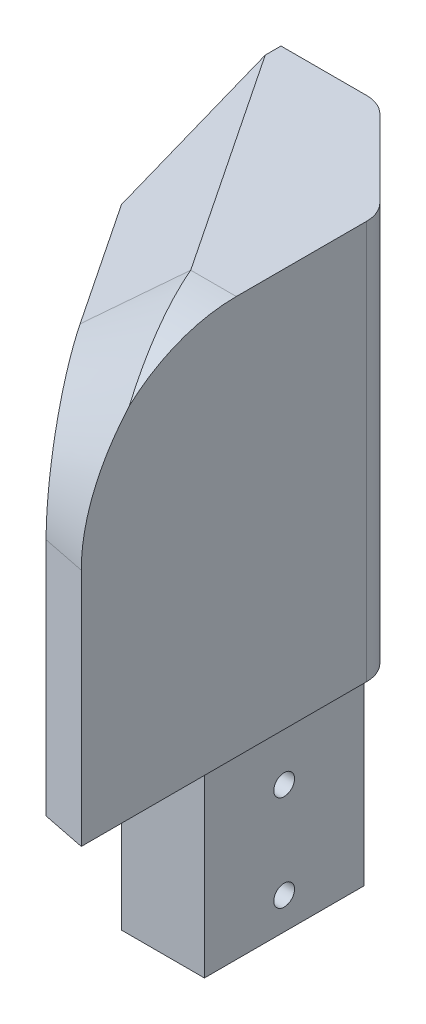
ISO-10303-21;
HEADER;
FILE_DESCRIPTION(('STEP AP214'),'2;1');
FILE_NAME('part.step','',(''),(''),'','','');
FILE_SCHEMA(('AUTOMOTIVE_DESIGN { 1 0 10303 214 1 1 1 1 }'));
ENDSEC;
DATA;
#1=APPLICATION_CONTEXT('core data for automotive mechanical design processes');
#2=APPLICATION_PROTOCOL_DEFINITION('international standard','automotive_design',2000,#1);
#3=PRODUCT_CONTEXT('',#1,'mechanical');
#4=PRODUCT('Part','Part','',(#3));
#5=PRODUCT_RELATED_PRODUCT_CATEGORY('part','',(#4));
#6=PRODUCT_DEFINITION_FORMATION('','',#4);
#7=PRODUCT_DEFINITION_CONTEXT('part definition',#1,'design');
#8=PRODUCT_DEFINITION('design','',#6,#7);
#9=PRODUCT_DEFINITION_SHAPE('','',#8);
#10=(LENGTH_UNIT() NAMED_UNIT(*) SI_UNIT(.MILLI.,.METRE.));
#11=(NAMED_UNIT(*) PLANE_ANGLE_UNIT() SI_UNIT($,.RADIAN.));
#12=(NAMED_UNIT(*) SI_UNIT($,.STERADIAN.) SOLID_ANGLE_UNIT());
#13=UNCERTAINTY_MEASURE_WITH_UNIT(LENGTH_MEASURE(1.E-05),#10,'distance_accuracy_value','');
#14=(GEOMETRIC_REPRESENTATION_CONTEXT(3) GLOBAL_UNCERTAINTY_ASSIGNED_CONTEXT((#13)) GLOBAL_UNIT_ASSIGNED_CONTEXT((#10,
#11,#12)) REPRESENTATION_CONTEXT('',''));
#15=CARTESIAN_POINT('',(0.,0.,0.));
#16=DIRECTION('',(0.,0.,1.));
#17=DIRECTION('',(1.,0.,0.));
#18=AXIS2_PLACEMENT_3D('',#15,#16,#17);
#19=CARTESIAN_POINT('',(-2.6,0.,-5.));
#20=DIRECTION('',(0.,0.,-1.));
#21=DIRECTION('',(-1.,0.,0.));
#22=AXIS2_PLACEMENT_3D('',#19,#20,#21);
#23=PLANE('',#22);
#24=DIRECTION('',(1.,0.,0.));
#25=VECTOR('',#24,1.);
#26=CARTESIAN_POINT('',(-2.6,43.,-5.));
#27=LINE('',#26,#25);
#28=CARTESIAN_POINT('',(-2.6,43.,-5.));
#29=VERTEX_POINT('',#28);
#30=CARTESIAN_POINT('',(2.77157287525379,43.,-5.));
#31=VERTEX_POINT('',#30);
#32=EDGE_CURVE('E206',#29,#31,#27,.T.);
#33=ORIENTED_EDGE('',*,*,#32,.T.);
#34=DIRECTION('',(0.,1.,0.));
#35=VECTOR('',#34,1.);
#36=CARTESIAN_POINT('',(2.77157287525379,0.,-5.));
#37=LINE('',#36,#35);
#38=CARTESIAN_POINT('',(2.77157287525379,17.5600968657159,-5.));
#39=VERTEX_POINT('',#38);
#40=EDGE_CURVE('E513',#31,#39,#37,.F.);
#41=ORIENTED_EDGE('',*,*,#40,.T.);
#42=CARTESIAN_POINT('',(3.6,17.,-5.));
#43=DIRECTION('',(0.,0.,-1.));
#44=DIRECTION('',(-1.,0.,0.));
#45=AXIS2_PLACEMENT_3D('',#42,#43,#44);
#46=CIRCLE('',#45,1.);
#47=CARTESIAN_POINT('',(2.6,17.,-5.));
#48=VERTEX_POINT('',#47);
#49=EDGE_CURVE('E533',#39,#48,#46,.F.);
#50=ORIENTED_EDGE('',*,*,#49,.T.);
#51=DIRECTION('',(0.,1.,0.));
#52=VECTOR('',#51,1.);
#53=CARTESIAN_POINT('',(2.6,0.,-5.));
#54=LINE('',#53,#52);
#55=CARTESIAN_POINT('',(2.6,0.,-5.));
#56=VERTEX_POINT('',#55);
#57=EDGE_CURVE('E488',#56,#48,#54,.T.);
#58=ORIENTED_EDGE('',*,*,#57,.F.);
#59=DIRECTION('',(1.,0.,0.));
#60=VECTOR('',#59,1.);
#61=CARTESIAN_POINT('',(-2.6,0.,-5.));
#62=LINE('',#61,#60);
#63=CARTESIAN_POINT('',(0.75,0.,-5.));
#64=VERTEX_POINT('',#63);
#65=EDGE_CURVE('E207',#64,#56,#62,.T.);
#66=ORIENTED_EDGE('',*,*,#65,.F.);
#67=DIRECTION('',(0.,1.,0.));
#68=VECTOR('',#67,1.);
#69=CARTESIAN_POINT('',(0.75,0.,-5.));
#70=LINE('',#69,#68);
#71=CARTESIAN_POINT('',(0.75,12.,-5.));
#72=VERTEX_POINT('',#71);
#73=EDGE_CURVE('E464',#64,#72,#70,.T.);
#74=ORIENTED_EDGE('',*,*,#73,.T.);
#75=DIRECTION('',(-1.,0.,0.));
#76=VECTOR('',#75,1.);
#77=CARTESIAN_POINT('',(0.75,12.,-5.));
#78=LINE('',#77,#76);
#79=CARTESIAN_POINT('',(-0.75,12.,-5.));
#80=VERTEX_POINT('',#79);
#81=EDGE_CURVE('E199',#72,#80,#78,.T.);
#82=ORIENTED_EDGE('',*,*,#81,.T.);
#83=DIRECTION('',(0.,1.,0.));
#84=VECTOR('',#83,1.);
#85=CARTESIAN_POINT('',(-0.75,0.,-5.));
#86=LINE('',#85,#84);
#87=CARTESIAN_POINT('',(-0.75,0.,-5.));
#88=VERTEX_POINT('',#87);
#89=EDGE_CURVE('E183',#88,#80,#86,.T.);
#90=ORIENTED_EDGE('',*,*,#89,.F.);
#91=CARTESIAN_POINT('',(-2.6,0.,-5.));
#92=VERTEX_POINT('',#91);
#93=EDGE_CURVE('E196',#92,#88,#62,.T.);
#94=ORIENTED_EDGE('',*,*,#93,.F.);
#95=DIRECTION('',(0.,1.,0.));
#96=VECTOR('',#95,1.);
#97=CARTESIAN_POINT('',(-2.6,0.,-5.));
#98=LINE('',#97,#96);
#99=EDGE_CURVE('E499',#92,#29,#98,.T.);
#100=ORIENTED_EDGE('',*,*,#99,.T.);
#101=EDGE_LOOP('',(#33,#41,#50,#58,#66,#74,#82,#90,#94,#100));
#102=FACE_BOUND('',#101,.T.);
#103=ADVANCED_FACE('F44',(#102),#23,.T.);
#104=CARTESIAN_POINT('',(-2.6,0.,0.));
#105=DIRECTION('',(0.,-1.,0.));
#106=DIRECTION('',(0.,0.,-1.));
#107=AXIS2_PLACEMENT_3D('',#104,#105,#106);
#108=PLANE('',#107);
#109=DIRECTION('',(-1.,0.,0.));
#110=VECTOR('',#109,1.);
#111=CARTESIAN_POINT('',(0.75,0.,2.75619856281309));
#112=LINE('',#111,#110);
#113=CARTESIAN_POINT('',(0.75,0.,2.75619856281309));
#114=VERTEX_POINT('',#113);
#115=CARTESIAN_POINT('',(-0.75,0.,2.75619856281309));
#116=VERTEX_POINT('',#115);
#117=EDGE_CURVE('E470',#114,#116,#112,.T.);
#118=ORIENTED_EDGE('',*,*,#117,.F.);
#119=DIRECTION('',(0.,0.,-1.));
#120=VECTOR('',#119,1.);
#121=CARTESIAN_POINT('',(0.75,0.,-2.85189418655657));
#122=LINE('',#121,#120);
#123=EDGE_CURVE('E461',#114,#64,#122,.T.);
#124=ORIENTED_EDGE('',*,*,#123,.T.);
#125=ORIENTED_EDGE('',*,*,#65,.T.);
#126=DIRECTION('',(0.,0.,-1.));
#127=VECTOR('',#126,1.);
#128=CARTESIAN_POINT('',(2.6,0.,0.));
#129=LINE('',#128,#127);
#130=CARTESIAN_POINT('',(2.6,0.,5.));
#131=VERTEX_POINT('',#130);
#132=EDGE_CURVE('E485',#131,#56,#129,.T.);
#133=ORIENTED_EDGE('',*,*,#132,.F.);
#134=DIRECTION('',(1.,0.,0.));
#135=VECTOR('',#134,1.);
#136=CARTESIAN_POINT('',(-2.6,0.,5.));
#137=LINE('',#136,#135);
#138=CARTESIAN_POINT('',(-2.6,0.,5.));
#139=VERTEX_POINT('',#138);
#140=EDGE_CURVE('E211',#139,#131,#137,.T.);
#141=ORIENTED_EDGE('',*,*,#140,.F.);
#142=DIRECTION('',(0.,0.,-1.));
#143=VECTOR('',#142,1.);
#144=CARTESIAN_POINT('',(-2.6,0.,0.));
#145=LINE('',#144,#143);
#146=EDGE_CURVE('E204',#139,#92,#145,.T.);
#147=ORIENTED_EDGE('',*,*,#146,.T.);
#148=ORIENTED_EDGE('',*,*,#93,.T.);
#149=DIRECTION('',(0.,0.,-1.));
#150=VECTOR('',#149,1.);
#151=CARTESIAN_POINT('',(-0.75,0.,-2.85189418655657));
#152=LINE('',#151,#150);
#153=EDGE_CURVE('E178',#116,#88,#152,.T.);
#154=ORIENTED_EDGE('',*,*,#153,.F.);
#155=EDGE_LOOP('',(#118,#124,#125,#133,#141,#147,#148,#154));
#156=FACE_BOUND('',#155,.T.);
#157=ADVANCED_FACE('F202',(#156),#108,.T.);
#158=CARTESIAN_POINT('',(-2.6,2.,0.));
#159=DIRECTION('',(1.,0.,0.));
#160=DIRECTION('',(0.,0.,-1.));
#161=AXIS2_PLACEMENT_3D('',#158,#159,#160);
#162=CYLINDRICAL_SURFACE('',#161,0.65);
#163=CARTESIAN_POINT('',(2.6,2.,0.));
#164=DIRECTION('',(1.,0.,0.));
#165=DIRECTION('',(0.,0.,-1.));
#166=AXIS2_PLACEMENT_3D('',#163,#164,#165);
#167=CIRCLE('',#166,0.65);
#168=CARTESIAN_POINT('',(2.6,2.,-0.65));
#169=VERTEX_POINT('',#168);
#170=EDGE_CURVE('E479',#169,#169,#167,.T.);
#171=ORIENTED_EDGE('',*,*,#170,.T.);
#172=EDGE_LOOP('',(#171));
#173=FACE_BOUND('',#172,.T.);
#174=CARTESIAN_POINT('',(0.75,2.,0.));
#175=DIRECTION('',(-1.,0.,0.));
#176=DIRECTION('',(0.,0.,1.));
#177=AXIS2_PLACEMENT_3D('',#174,#175,#176);
#178=CIRCLE('',#177,0.65);
#179=CARTESIAN_POINT('',(0.75,2.,0.65));
#180=VERTEX_POINT('',#179);
#181=EDGE_CURVE('E223',#180,#180,#178,.F.);
#182=ORIENTED_EDGE('',*,*,#181,.F.);
#183=EDGE_LOOP('',(#182));
#184=FACE_BOUND('',#183,.T.);
#185=ADVANCED_FACE('F345',(#173,#184),#162,.F.);
#186=CARTESIAN_POINT('',(-2.6,8.,0.));
#187=DIRECTION('',(1.,0.,0.));
#188=DIRECTION('',(0.,0.,-1.));
#189=AXIS2_PLACEMENT_3D('',#186,#187,#188);
#190=CYLINDRICAL_SURFACE('',#189,0.649999999999999);
#191=CARTESIAN_POINT('',(2.6,8.,0.));
#192=DIRECTION('',(1.,0.,0.));
#193=DIRECTION('',(0.,0.,-1.));
#194=AXIS2_PLACEMENT_3D('',#191,#192,#193);
#195=CIRCLE('',#194,0.649999999999999);
#196=CARTESIAN_POINT('',(2.6,8.,-0.649999999999999));
#197=VERTEX_POINT('',#196);
#198=EDGE_CURVE('E491',#197,#197,#195,.T.);
#199=ORIENTED_EDGE('',*,*,#198,.T.);
#200=EDGE_LOOP('',(#199));
#201=FACE_BOUND('',#200,.T.);
#202=CARTESIAN_POINT('',(0.75,8.,0.));
#203=DIRECTION('',(-1.,0.,0.));
#204=DIRECTION('',(0.,0.,1.));
#205=AXIS2_PLACEMENT_3D('',#202,#203,#204);
#206=CIRCLE('',#205,0.649999999999999);
#207=CARTESIAN_POINT('',(0.75,8.,0.649999999999999));
#208=VERTEX_POINT('',#207);
#209=EDGE_CURVE('E220',#208,#208,#206,.F.);
#210=ORIENTED_EDGE('',*,*,#209,.F.);
#211=EDGE_LOOP('',(#210));
#212=FACE_BOUND('',#211,.T.);
#213=ADVANCED_FACE('F340',(#201,#212),#190,.F.);
#214=CARTESIAN_POINT('',(-2.6,43.,0.));
#215=DIRECTION('',(0.,-1.,0.));
#216=DIRECTION('',(0.,0.,-1.));
#217=AXIS2_PLACEMENT_3D('',#214,#215,#216);
#218=PLANE('',#217);
#219=DIRECTION('',(0.,0.,-1.));
#220=VECTOR('',#219,1.);
#221=CARTESIAN_POINT('',(-2.6,43.,0.));
#222=LINE('',#221,#220);
#223=CARTESIAN_POINT('',(-2.6,43.,-4.01387818866041));
#224=VERTEX_POINT('',#223);
#225=EDGE_CURVE('E358',#224,#29,#222,.T.);
#226=ORIENTED_EDGE('',*,*,#225,.F.);
#227=DIRECTION('',(0.554700196225228,0.,0.832050294337844));
#228=VECTOR('',#227,1.);
#229=CARTESIAN_POINT('',(4.89358480502275,43.,7.22649901887375));
#230=LINE('',#229,#228);
#231=CARTESIAN_POINT('',(6.74258545910691,43.,10.));
#232=VERTEX_POINT('',#231);
#233=EDGE_CURVE('E245',#224,#232,#230,.T.);
#234=ORIENTED_EDGE('',*,*,#233,.T.);
#235=DIRECTION('',(1.,0.,0.));
#236=VECTOR('',#235,1.);
#237=CARTESIAN_POINT('',(-2.6,43.,10.));
#238=LINE('',#237,#236);
#239=CARTESIAN_POINT('',(9.6,43.,10.));
#240=VERTEX_POINT('',#239);
#241=EDGE_CURVE('E228',#232,#240,#238,.T.);
#242=ORIENTED_EDGE('',*,*,#241,.T.);
#243=DIRECTION('',(0.,0.,1.));
#244=VECTOR('',#243,1.);
#245=CARTESIAN_POINT('',(9.6,43.,-5.));
#246=LINE('',#245,#244);
#247=CARTESIAN_POINT('',(9.6,43.,1.8284271247462));
#248=VERTEX_POINT('',#247);
#249=EDGE_CURVE('E439',#248,#240,#246,.T.);
#250=ORIENTED_EDGE('',*,*,#249,.F.);
#251=CARTESIAN_POINT('',(7.6,43.,1.8284271247462));
#252=DIRECTION('',(0.,-1.,0.));
#253=DIRECTION('',(0.,0.,-1.));
#254=AXIS2_PLACEMENT_3D('',#251,#252,#253);
#255=CIRCLE('',#254,2.);
#256=CARTESIAN_POINT('',(9.01421356237309,43.,0.414213562373101));
#257=VERTEX_POINT('',#256);
#258=EDGE_CURVE('E869',#248,#257,#255,.F.);
#259=ORIENTED_EDGE('',*,*,#258,.T.);
#260=DIRECTION('',(0.707106781186549,0.,0.707106781186546));
#261=VECTOR('',#260,1.);
#262=CARTESIAN_POINT('',(9.6,43.,1.00000000000001));
#263=LINE('',#262,#261);
#264=CARTESIAN_POINT('',(4.18578643762688,43.,-4.4142135623731));
#265=VERTEX_POINT('',#264);
#266=EDGE_CURVE('E875',#257,#265,#263,.F.);
#267=ORIENTED_EDGE('',*,*,#266,.T.);
#268=CARTESIAN_POINT('',(2.77157287525379,43.,-3.));
#269=DIRECTION('',(0.,-1.,0.));
#270=DIRECTION('',(0.,0.,-1.));
#271=AXIS2_PLACEMENT_3D('',#268,#269,#270);
#272=CIRCLE('',#271,2.);
#273=EDGE_CURVE('E871',#265,#31,#272,.F.);
#274=ORIENTED_EDGE('',*,*,#273,.T.);
#275=ORIENTED_EDGE('',*,*,#32,.F.);
#276=EDGE_LOOP('',(#226,#234,#242,#250,#259,#267,#274,#275));
#277=FACE_BOUND('',#276,.T.);
#278=ADVANCED_FACE('F348',(#277),#218,.F.);
#279=CARTESIAN_POINT('',(-2.6,0.,5.));
#280=DIRECTION('',(0.,0.,-1.));
#281=DIRECTION('',(-1.,0.,0.));
#282=AXIS2_PLACEMENT_3D('',#279,#280,#281);
#283=PLANE('',#282);
#284=DIRECTION('',(0.,1.,0.));
#285=VECTOR('',#284,1.);
#286=CARTESIAN_POINT('',(2.6,0.,5.));
#287=LINE('',#286,#285);
#288=CARTESIAN_POINT('',(2.6,12.,5.));
#289=VERTEX_POINT('',#288);
#290=EDGE_CURVE('E482',#131,#289,#287,.T.);
#291=ORIENTED_EDGE('',*,*,#290,.T.);
#292=DIRECTION('',(-1.,0.,0.));
#293=VECTOR('',#292,1.);
#294=CARTESIAN_POINT('',(-2.6,12.,5.));
#295=LINE('',#294,#293);
#296=CARTESIAN_POINT('',(-2.6,12.,4.99999999999993));
#297=VERTEX_POINT('',#296);
#298=EDGE_CURVE('E509',#289,#297,#295,.T.);
#299=ORIENTED_EDGE('',*,*,#298,.T.);
#300=DIRECTION('',(0.,1.,0.));
#301=VECTOR('',#300,1.);
#302=CARTESIAN_POINT('',(-2.6,0.,5.));
#303=LINE('',#302,#301);
#304=EDGE_CURVE('E362',#139,#297,#303,.T.);
#305=ORIENTED_EDGE('',*,*,#304,.F.);
#306=ORIENTED_EDGE('',*,*,#140,.T.);
#307=EDGE_LOOP('',(#291,#299,#305,#306));
#308=FACE_BOUND('',#307,.T.);
#309=ADVANCED_FACE('F346',(#308),#283,.F.);
#310=CARTESIAN_POINT('',(-0.75,2.,0.));
#311=DIRECTION('',(-1.,0.,0.));
#312=DIRECTION('',(0.,0.,1.));
#313=AXIS2_PLACEMENT_3D('',#310,#311,#312);
#314=CIRCLE('',#313,0.65);
#315=CARTESIAN_POINT('',(-0.75,2.,0.65));
#316=VERTEX_POINT('',#315);
#317=EDGE_CURVE('E219',#316,#316,#314,.F.);
#318=ORIENTED_EDGE('',*,*,#317,.T.);
#319=EDGE_LOOP('',(#318));
#320=FACE_BOUND('',#319,.T.);
#321=CARTESIAN_POINT('',(-2.6,2.,0.));
#322=DIRECTION('',(1.,0.,0.));
#323=DIRECTION('',(0.,0.,-1.));
#324=AXIS2_PLACEMENT_3D('',#321,#322,#323);
#325=CIRCLE('',#324,0.65);
#326=CARTESIAN_POINT('',(-2.6,2.,-0.65));
#327=VERTEX_POINT('',#326);
#328=EDGE_CURVE('E363',#327,#327,#325,.T.);
#329=ORIENTED_EDGE('',*,*,#328,.F.);
#330=EDGE_LOOP('',(#329));
#331=FACE_BOUND('',#330,.T.);
#332=ADVANCED_FACE('F277',(#320,#331),#162,.F.);
#333=CARTESIAN_POINT('',(-0.75,8.,0.));
#334=DIRECTION('',(-1.,0.,0.));
#335=DIRECTION('',(0.,0.,1.));
#336=AXIS2_PLACEMENT_3D('',#333,#334,#335);
#337=CIRCLE('',#336,0.649999999999999);
#338=CARTESIAN_POINT('',(-0.75,8.,0.649999999999999));
#339=VERTEX_POINT('',#338);
#340=EDGE_CURVE('E216',#339,#339,#337,.F.);
#341=ORIENTED_EDGE('',*,*,#340,.T.);
#342=EDGE_LOOP('',(#341));
#343=FACE_BOUND('',#342,.T.);
#344=CARTESIAN_POINT('',(-2.6,8.,0.));
#345=DIRECTION('',(1.,0.,0.));
#346=DIRECTION('',(0.,0.,-1.));
#347=AXIS2_PLACEMENT_3D('',#344,#345,#346);
#348=CIRCLE('',#347,0.649999999999999);
#349=CARTESIAN_POINT('',(-2.6,8.,-0.649999999999999));
#350=VERTEX_POINT('',#349);
#351=EDGE_CURVE('E215',#350,#350,#348,.T.);
#352=ORIENTED_EDGE('',*,*,#351,.F.);
#353=EDGE_LOOP('',(#352));
#354=FACE_BOUND('',#353,.T.);
#355=ADVANCED_FACE('F335',(#343,#354),#190,.F.);
#356=CARTESIAN_POINT('',(-2.6,0.,0.));
#357=DIRECTION('',(1.,0.,0.));
#358=DIRECTION('',(0.,0.,-1.));
#359=AXIS2_PLACEMENT_3D('',#356,#357,#358);
#360=PLANE('',#359);
#361=ORIENTED_EDGE('',*,*,#328,.T.);
#362=EDGE_LOOP('',(#361));
#363=FACE_BOUND('',#362,.T.);
#364=DIRECTION('',(0.,1.,0.));
#365=VECTOR('',#364,1.);
#366=CARTESIAN_POINT('',(-2.6,0.,4.99999999999993));
#367=LINE('',#366,#365);
#368=CARTESIAN_POINT('',(-2.6,39.3944487245359,4.99999999999993));
#369=VERTEX_POINT('',#368);
#370=EDGE_CURVE('E209',#297,#369,#367,.T.);
#371=ORIENTED_EDGE('',*,*,#370,.T.);
#372=DIRECTION('',(0.,-0.371390676354102,0.92847669088526));
#373=VECTOR('',#372,1.);
#374=CARTESIAN_POINT('',(-2.6,42.0417797427601,-1.61832754556069));
#375=LINE('',#374,#373);
#376=EDGE_CURVE('E368',#369,#224,#375,.F.);
#377=ORIENTED_EDGE('',*,*,#376,.T.);
#378=ORIENTED_EDGE('',*,*,#225,.T.);
#379=ORIENTED_EDGE('',*,*,#99,.F.);
#380=ORIENTED_EDGE('',*,*,#146,.F.);
#381=ORIENTED_EDGE('',*,*,#304,.T.);
#382=EDGE_LOOP('',(#371,#377,#378,#379,#380,#381));
#383=FACE_BOUND('',#382,.T.);
#384=ORIENTED_EDGE('',*,*,#351,.T.);
#385=EDGE_LOOP('',(#384));
#386=FACE_BOUND('',#385,.T.);
#387=ADVANCED_FACE('F331',(#363,#383,#386),#360,.F.);
#388=CARTESIAN_POINT('',(2.6,0.,0.));
#389=DIRECTION('',(1.,0.,0.));
#390=DIRECTION('',(0.,0.,-1.));
#391=AXIS2_PLACEMENT_3D('',#388,#389,#390);
#392=PLANE('',#391);
#393=ORIENTED_EDGE('',*,*,#57,.T.);
#394=DIRECTION('',(0.,0.,-1.));
#395=VECTOR('',#394,1.);
#396=CARTESIAN_POINT('',(2.6,17.,11.));
#397=LINE('',#396,#395);
#398=CARTESIAN_POINT('',(2.6,17.,7.6833752096446));
#399=VERTEX_POINT('',#398);
#400=EDGE_CURVE('E524',#48,#399,#397,.F.);
#401=ORIENTED_EDGE('',*,*,#400,.T.);
#402=CARTESIAN_POINT('',(2.6,12.,11.));
#403=DIRECTION('',(1.,0.,0.));
#404=DIRECTION('',(0.,0.,-1.));
#405=AXIS2_PLACEMENT_3D('',#402,#403,#404);
#406=CIRCLE('',#405,6.);
#407=EDGE_CURVE('E520',#399,#289,#406,.F.);
#408=ORIENTED_EDGE('',*,*,#407,.T.);
#409=ORIENTED_EDGE('',*,*,#290,.F.);
#410=ORIENTED_EDGE('',*,*,#132,.T.);
#411=EDGE_LOOP('',(#393,#401,#408,#409,#410));
#412=FACE_BOUND('',#411,.T.);
#413=ORIENTED_EDGE('',*,*,#170,.F.);
#414=EDGE_LOOP('',(#413));
#415=FACE_BOUND('',#414,.T.);
#416=ORIENTED_EDGE('',*,*,#198,.F.);
#417=EDGE_LOOP('',(#416));
#418=FACE_BOUND('',#417,.T.);
#419=ADVANCED_FACE('F321',(#412,#415,#418),#392,.T.);
#420=CARTESIAN_POINT('',(0.75,0.,0.));
#421=DIRECTION('',(-1.,0.,0.));
#422=DIRECTION('',(0.,0.,1.));
#423=AXIS2_PLACEMENT_3D('',#420,#421,#422);
#424=PLANE('',#423);
#425=ORIENTED_EDGE('',*,*,#123,.F.);
#426=DIRECTION('',(0.,-0.998508217849995,0.0546016381258519));
#427=VECTOR('',#426,1.);
#428=CARTESIAN_POINT('',(0.75,0.,2.75619856281309));
#429=LINE('',#428,#427);
#430=CARTESIAN_POINT('',(0.75,12.,2.1));
#431=VERTEX_POINT('',#430);
#432=EDGE_CURVE('E468',#431,#114,#429,.T.);
#433=ORIENTED_EDGE('',*,*,#432,.F.);
#434=DIRECTION('',(0.,0.,1.));
#435=VECTOR('',#434,1.);
#436=CARTESIAN_POINT('',(0.75,12.,-2.1));
#437=LINE('',#436,#435);
#438=EDGE_CURVE('E466',#72,#431,#437,.T.);
#439=ORIENTED_EDGE('',*,*,#438,.F.);
#440=ORIENTED_EDGE('',*,*,#73,.F.);
#441=EDGE_LOOP('',(#425,#433,#439,#440));
#442=FACE_BOUND('',#441,.T.);
#443=ORIENTED_EDGE('',*,*,#209,.T.);
#444=EDGE_LOOP('',(#443));
#445=FACE_BOUND('',#444,.T.);
#446=ORIENTED_EDGE('',*,*,#181,.T.);
#447=EDGE_LOOP('',(#446));
#448=FACE_BOUND('',#447,.T.);
#449=ADVANCED_FACE('F317',(#442,#445,#448),#424,.T.);
#450=CARTESIAN_POINT('',(-0.75,0.,0.));
#451=DIRECTION('',(-1.,0.,0.));
#452=DIRECTION('',(0.,0.,1.));
#453=AXIS2_PLACEMENT_3D('',#450,#451,#452);
#454=PLANE('',#453);
#455=ORIENTED_EDGE('',*,*,#340,.F.);
#456=EDGE_LOOP('',(#455));
#457=FACE_BOUND('',#456,.T.);
#458=ORIENTED_EDGE('',*,*,#153,.T.);
#459=ORIENTED_EDGE('',*,*,#89,.T.);
#460=DIRECTION('',(0.,0.,1.));
#461=VECTOR('',#460,1.);
#462=CARTESIAN_POINT('',(-0.75,12.,-2.1));
#463=LINE('',#462,#461);
#464=CARTESIAN_POINT('',(-0.75,12.,2.1));
#465=VERTEX_POINT('',#464);
#466=EDGE_CURVE('E200',#80,#465,#463,.T.);
#467=ORIENTED_EDGE('',*,*,#466,.T.);
#468=DIRECTION('',(0.,-0.998508217849995,0.0546016381258519));
#469=VECTOR('',#468,1.);
#470=CARTESIAN_POINT('',(-0.75,0.,2.75619856281309));
#471=LINE('',#470,#469);
#472=EDGE_CURVE('E186',#465,#116,#471,.T.);
#473=ORIENTED_EDGE('',*,*,#472,.T.);
#474=EDGE_LOOP('',(#458,#459,#467,#473));
#475=FACE_BOUND('',#474,.T.);
#476=ORIENTED_EDGE('',*,*,#317,.F.);
#477=EDGE_LOOP('',(#476));
#478=FACE_BOUND('',#477,.T.);
#479=ADVANCED_FACE('F180',(#457,#475,#478),#454,.F.);
#480=CARTESIAN_POINT('',(0.75,12.,2.1));
#481=DIRECTION('',(0.,-1.,0.));
#482=DIRECTION('',(0.,0.,-1.));
#483=AXIS2_PLACEMENT_3D('',#480,#481,#482);
#484=PLANE('',#483);
#485=ORIENTED_EDGE('',*,*,#81,.F.);
#486=ORIENTED_EDGE('',*,*,#438,.T.);
#487=DIRECTION('',(-1.,0.,0.));
#488=VECTOR('',#487,1.);
#489=CARTESIAN_POINT('',(0.75,12.,2.1));
#490=LINE('',#489,#488);
#491=EDGE_CURVE('E472',#431,#465,#490,.T.);
#492=ORIENTED_EDGE('',*,*,#491,.T.);
#493=ORIENTED_EDGE('',*,*,#466,.F.);
#494=EDGE_LOOP('',(#485,#486,#492,#493));
#495=FACE_BOUND('',#494,.T.);
#496=ADVANCED_FACE('F316',(#495),#484,.T.);
#497=CARTESIAN_POINT('',(0.75,0.,2.75619856281309));
#498=DIRECTION('',(0.,-0.0546016381258519,-0.998508217849995));
#499=DIRECTION('',(0.,0.998508217849995,-0.054601638125852));
#500=AXIS2_PLACEMENT_3D('',#497,#498,#499);
#501=PLANE('',#500);
#502=ORIENTED_EDGE('',*,*,#491,.F.);
#503=ORIENTED_EDGE('',*,*,#432,.T.);
#504=ORIENTED_EDGE('',*,*,#117,.T.);
#505=ORIENTED_EDGE('',*,*,#472,.F.);
#506=EDGE_LOOP('',(#502,#503,#504,#505));
#507=FACE_BOUND('',#506,.T.);
#508=ADVANCED_FACE('F312',(#507),#501,.T.);
#509=CARTESIAN_POINT('',(2.6,18.,20.));
#510=DIRECTION('',(0.,-1.,0.));
#511=DIRECTION('',(0.,0.,-1.));
#512=AXIS2_PLACEMENT_3D('',#509,#510,#511);
#513=PLANE('',#512);
#514=DIRECTION('',(0.,0.,-1.));
#515=VECTOR('',#514,1.);
#516=CARTESIAN_POINT('',(9.6,18.,20.));
#517=LINE('',#516,#515);
#518=CARTESIAN_POINT('',(9.6,18.,19.7188897449072));
#519=VERTEX_POINT('',#518);
#520=CARTESIAN_POINT('',(9.6,18.,1.8284271247462));
#521=VERTEX_POINT('',#520);
#522=EDGE_CURVE('E191',#519,#521,#517,.T.);
#523=ORIENTED_EDGE('',*,*,#522,.F.);
#524=DIRECTION('',(0.980580675690921,0.,0.196116135138183));
#525=VECTOR('',#524,1.);
#526=CARTESIAN_POINT('',(2.92329043367169,18.,18.3835478316415));
#527=LINE('',#526,#525);
#528=CARTESIAN_POINT('',(6.84529980377477,18.,19.1679497056621));
#529=VERTEX_POINT('',#528);
#530=EDGE_CURVE('E11',#519,#529,#527,.F.);
#531=ORIENTED_EDGE('',*,*,#530,.T.);
#532=DIRECTION('',(0.554700196225228,0.,0.832050294337844));
#533=VECTOR('',#532,1.);
#534=CARTESIAN_POINT('',(5.92307692307694,18.,17.7846153846154));
#535=LINE('',#534,#533);
#536=CARTESIAN_POINT('',(1.40000000000003,18.,11.));
#537=VERTEX_POINT('',#536);
#538=EDGE_CURVE('E226',#529,#537,#535,.F.);
#539=ORIENTED_EDGE('',*,*,#538,.T.);
#540=DIRECTION('',(-1.,0.,0.));
#541=VECTOR('',#540,1.);
#542=CARTESIAN_POINT('',(2.6,18.,11.));
#543=LINE('',#542,#541);
#544=CARTESIAN_POINT('',(3.6,18.,11.));
#545=VERTEX_POINT('',#544);
#546=EDGE_CURVE('E447',#537,#545,#543,.F.);
#547=ORIENTED_EDGE('',*,*,#546,.T.);
#548=DIRECTION('',(0.,0.,-1.));
#549=VECTOR('',#548,1.);
#550=CARTESIAN_POINT('',(3.6,18.,-5.));
#551=LINE('',#550,#549);
#552=CARTESIAN_POINT('',(3.6,18.,-4.8203594422489));
#553=VERTEX_POINT('',#552);
#554=EDGE_CURVE('E522',#545,#553,#551,.T.);
#555=ORIENTED_EDGE('',*,*,#554,.T.);
#556=CARTESIAN_POINT('',(2.77157287525379,18.,-3.));
#557=DIRECTION('',(0.,-1.,0.));
#558=DIRECTION('',(0.,0.,-1.));
#559=AXIS2_PLACEMENT_3D('',#556,#557,#558);
#560=CIRCLE('',#559,2.);
#561=CARTESIAN_POINT('',(4.18578643762688,18.,-4.4142135623731));
#562=VERTEX_POINT('',#561);
#563=EDGE_CURVE('E863',#553,#562,#560,.T.);
#564=ORIENTED_EDGE('',*,*,#563,.T.);
#565=DIRECTION('',(-0.707106781186549,0.,-0.707106781186546));
#566=VECTOR('',#565,1.);
#567=CARTESIAN_POINT('',(15.6,18.,6.99999999999996));
#568=LINE('',#567,#566);
#569=CARTESIAN_POINT('',(9.0142135623731,18.,0.414213562373096));
#570=VERTEX_POINT('',#569);
#571=EDGE_CURVE('E874',#562,#570,#568,.F.);
#572=ORIENTED_EDGE('',*,*,#571,.T.);
#573=CARTESIAN_POINT('',(7.6,18.,1.8284271247462));
#574=DIRECTION('',(0.,-1.,0.));
#575=DIRECTION('',(0.,0.,-1.));
#576=AXIS2_PLACEMENT_3D('',#573,#574,#575);
#577=CIRCLE('',#576,2.);
#578=EDGE_CURVE('E452',#570,#521,#577,.T.);
#579=ORIENTED_EDGE('',*,*,#578,.T.);
#580=EDGE_LOOP('',(#523,#531,#539,#547,#555,#564,#572,#579));
#581=FACE_BOUND('',#580,.T.);
#582=ADVANCED_FACE('F309',(#581),#513,.T.);
#583=CARTESIAN_POINT('',(9.6,0.,0.));
#584=DIRECTION('',(1.,0.,0.));
#585=DIRECTION('',(0.,0.,-1.));
#586=AXIS2_PLACEMENT_3D('',#583,#584,#585);
#587=PLANE('',#586);
#588=CARTESIAN_POINT('',(9.6,33.,10.));
#589=DIRECTION('',(1.,0.,0.));
#590=DIRECTION('',(0.,0.,-1.));
#591=AXIS2_PLACEMENT_3D('',#588,#589,#590);
#592=CIRCLE('',#591,10.);
#593=CARTESIAN_POINT('',(9.6,40.4210022982452,16.7028740112381));
#594=VERTEX_POINT('',#593);
#595=EDGE_CURVE('E236',#240,#594,#592,.T.);
#596=ORIENTED_EDGE('',*,*,#595,.T.);
#597=CARTESIAN_POINT('',(9.6,33.,19.7188897449072));
#598=CARTESIAN_POINT('',(9.60000032217803,33.1685381935335,19.718908239892));
#599=CARTESIAN_POINT('',(9.60000197007212,33.337071879671,19.7145105530594));
#600=CARTESIAN_POINT('',(9.60000592231781,33.6746730596682,19.6969425898443));
#601=CARTESIAN_POINT('',(9.6000082304611,33.8437378909987,19.683721037364));
#602=CARTESIAN_POINT('',(9.60001147237364,34.1825416677815,19.6484020934984));
#603=CARTESIAN_POINT('',(9.60001239302781,34.352272025437,19.626222486073));
#604=CARTESIAN_POINT('',(9.60000672227784,34.6925317464287,19.5728013844049));
#605=CARTESIAN_POINT('',(9.60000003434447,34.8630434228403,19.5414472794076));
#606=CARTESIAN_POINT('',(9.5999999673046,35.1940875568208,19.4717645037327));
#607=CARTESIAN_POINT('',(9.60000596459215,35.3547060614738,19.4338430028264));
#608=CARTESIAN_POINT('',(9.60001902239096,35.6774829051022,19.3494802012619));
#609=CARTESIAN_POINT('',(9.60002610346659,35.8395968528111,19.3028691663773));
#610=CARTESIAN_POINT('',(9.60003151113373,36.1653883424182,19.2007587167977));
#611=CARTESIAN_POINT('',(9.60002961782285,36.3290060627659,19.1450686690125));
#612=CARTESIAN_POINT('',(9.60001484068881,36.6577835391577,19.024378613421));
#613=CARTESIAN_POINT('',(9.60000166199972,36.8228659858643,18.9591681229353));
#614=CARTESIAN_POINT('',(9.59999848207676,37.1356014397628,18.8270430283635));
#615=CARTESIAN_POINT('',(9.60000657065288,37.2835247973896,18.7607662061615));
#616=CARTESIAN_POINT('',(9.60002181996768,37.581178361554,18.6198693325543));
#617=CARTESIAN_POINT('',(9.60002894257969,37.7308141008826,18.5450497316858));
#618=CARTESIAN_POINT('',(9.6000323819991,38.0317555621748,18.3866053198052));
#619=CARTESIAN_POINT('',(9.60002833021831,38.1829503341058,18.3027699721576));
#620=CARTESIAN_POINT('',(9.60001300409359,38.486827195212,18.1258144218064));
#621=CARTESIAN_POINT('',(9.60000148557303,38.6393808679805,18.0324737670038));
#622=CARTESIAN_POINT('',(9.59999865968818,38.925711162121,17.8489132004286));
#623=CARTESIAN_POINT('',(9.60000548618209,39.0598652348663,17.7592805848403));
#624=CARTESIAN_POINT('',(9.60001722549765,39.3296827252591,17.5717232258145));
#625=CARTESIAN_POINT('',(9.60002205811981,39.4652181641418,17.4736143477067));
#626=CARTESIAN_POINT('',(9.60002276389529,39.7375376180977,17.2686520941483));
#627=CARTESIAN_POINT('',(9.60001829508746,39.8741786364455,17.1616088875885));
#628=CARTESIAN_POINT('',(9.60000670445506,40.1484066861395,16.9383194153923));
#629=CARTESIAN_POINT('',(9.59999948896569,40.285835185658,16.8218783350773));
#630=CARTESIAN_POINT('',(9.59999499313921,40.4209914760237,16.7028675741857));
#631=B_SPLINE_CURVE_WITH_KNOTS('',3,(#597,#598,#599,#600,#601,#602,#603,#604,#605,#606,#607,
#608,#609,#610,#611,#612,#613,#614,#615,#616,#617,#618,#619,#620,#621,#622,#623,#624,#625,#626,
#627,#628,#629,#630),.UNSPECIFIED.,.F.,.F.,(4,2,2,2,2,2,2,2,2,2,2,2,2,2,2,2,4),(0.,
0.505549867016602,1.01406340044448,1.52735409714273,2.04723017491981,2.54214435152102,
3.04799380954289,3.56630143958764,4.09857968514526,4.58471533261313,5.08645880110596,
5.60494843170083,6.14131257507107,6.62523035481085,7.12706272398764,7.64766994096971,
8.18790349388738),.UNSPECIFIED.);
#632=CARTESIAN_POINT('',(9.6,33.,19.7188897449072));
#633=VERTEX_POINT('',#632);
#634=EDGE_CURVE('E56',#594,#633,#631,.F.);
#635=ORIENTED_EDGE('',*,*,#634,.T.);
#636=DIRECTION('',(0.,1.,0.));
#637=VECTOR('',#636,1.);
#638=CARTESIAN_POINT('',(9.6,0.,19.7188897449072));
#639=LINE('',#638,#637);
#640=EDGE_CURVE('E68',#633,#519,#639,.F.);
#641=ORIENTED_EDGE('',*,*,#640,.T.);
#642=ORIENTED_EDGE('',*,*,#522,.T.);
#643=DIRECTION('',(0.,-1.,0.));
#644=VECTOR('',#643,1.);
#645=CARTESIAN_POINT('',(9.6,0.,1.8284271247462));
#646=LINE('',#645,#644);
#647=EDGE_CURVE('E862',#521,#248,#646,.F.);
#648=ORIENTED_EDGE('',*,*,#647,.T.);
#649=ORIENTED_EDGE('',*,*,#249,.T.);
#650=EDGE_LOOP('',(#596,#635,#641,#642,#648,#649));
#651=FACE_BOUND('',#650,.T.);
#652=ADVANCED_FACE('F276',(#651),#587,.T.);
#653=CARTESIAN_POINT('',(-2.6,0.,4.99999999999993));
#654=DIRECTION('',(0.832050294337844,0.,-0.554700196225228));
#655=DIRECTION('',(0.,1.,0.));
#656=AXIS2_PLACEMENT_3D('',#653,#654,#655);
#657=PLANE('',#656);
#658=CARTESIAN_POINT('',(2.58233398741753,39.3944487245359,12.7735009811262));
#659=CARTESIAN_POINT('',(2.86134600709093,39.3944769212711,13.1920190106363));
#660=CARTESIAN_POINT('',(3.14034647888294,39.353230002596,13.6105197183244));
#661=CARTESIAN_POINT('',(3.68764824366587,39.18993236804,14.4314723654988));
#662=CARTESIAN_POINT('',(3.95592688333113,39.0678602146072,14.8338903249967));
#663=CARTESIAN_POINT('',(4.4714738728212,38.7475403819761,15.6072108092318));
#664=CARTESIAN_POINT('',(4.7187208830951,38.5493059615022,15.9780813246426));
#665=CARTESIAN_POINT('',(5.18270091563634,38.0842736422545,16.6740513734545));
#666=CARTESIAN_POINT('',(5.39941473255362,37.8174949924339,16.9991220988304));
#667=CARTESIAN_POINT('',(5.79399731570676,37.2256211177041,17.5909959735601));
#668=CARTESIAN_POINT('',(5.97184974882492,36.9005503925428,17.8577746232374));
#669=CARTESIAN_POINT('',(6.28187129518126,36.2045803433018,18.3228069427719));
#670=CARTESIAN_POINT('',(6.41402757527697,35.8337098285567,18.5210413629154));
#671=CARTESIAN_POINT('',(6.62757413061354,35.0603893434192,18.8413611959203));
#672=CARTESIAN_POINT('',(6.70895556602585,34.6579713850134,18.9634333490387));
#673=CARTESIAN_POINT('',(6.81782065589986,33.8370187365572,19.1267309838498));
#674=CARTESIAN_POINT('',(6.84531860159828,33.4185180295101,19.1679779023974));
#675=CARTESIAN_POINT('',(6.84529980377478,33.,19.1679497056621));
#676=B_SPLINE_CURVE_WITH_KNOTS('',3,(#658,#659,#660,#661,#662,#663,#664,#665,#666,#667,#668,
#669,#670,#671,#672,#673,#674,#675),.UNSPECIFIED.,.F.,.F.,(4,2,2,2,2,2,2,2,4),(-1.5707963267949,
-1.37444678594553,-1.17809724509617,-0.98174770424681,-0.785398163397448,-0.589048622548086,
-0.392699081698724,-0.196349540849362,0.),.UNSPECIFIED.);
#677=CARTESIAN_POINT('',(6.84529980377477,33.,19.1679497056621));
#678=VERTEX_POINT('',#677);
#679=CARTESIAN_POINT('',(2.58233398741753,39.3944487245359,12.7735009811262));
#680=VERTEX_POINT('',#679);
#681=EDGE_CURVE('E254',#678,#680,#676,.F.);
#682=ORIENTED_EDGE('',*,*,#681,.T.);
#683=DIRECTION('',(0.554700196225228,0.,0.832050294337844));
#684=VECTOR('',#683,1.);
#685=CARTESIAN_POINT('',(-2.6,39.3944487245359,4.99999999999993));
#686=LINE('',#685,#684);
#687=EDGE_CURVE('E373',#680,#369,#686,.F.);
#688=ORIENTED_EDGE('',*,*,#687,.T.);
#689=ORIENTED_EDGE('',*,*,#370,.F.);
#690=CARTESIAN_POINT('',(1.40000000000003,12.,11.));
#691=DIRECTION('',(0.832050294337844,0.,-0.554700196225228));
#692=DIRECTION('',(-0.554700196225228,0.,-0.832050294337844));
#693=AXIS2_PLACEMENT_3D('',#690,#691,#692);
#694=ELLIPSE('',#693,7.21110255092797,6.);
#695=EDGE_CURVE('E444',#297,#537,#694,.T.);
#696=ORIENTED_EDGE('',*,*,#695,.T.);
#697=ORIENTED_EDGE('',*,*,#538,.F.);
#698=DIRECTION('',(0.,-1.,0.));
#699=VECTOR('',#698,1.);
#700=CARTESIAN_POINT('',(6.84529980377477,33.,19.1679497056621));
#701=LINE('',#700,#699);
#702=EDGE_CURVE('E248',#529,#678,#701,.F.);
#703=ORIENTED_EDGE('',*,*,#702,.T.);
#704=EDGE_LOOP('',(#682,#688,#689,#696,#697,#703));
#705=FACE_BOUND('',#704,.T.);
#706=ADVANCED_FACE('F262',(#705),#657,.F.);
#707=CARTESIAN_POINT('',(-2.6,33.,10.));
#708=DIRECTION('',(1.,0.,0.));
#709=DIRECTION('',(0.,0.,-1.));
#710=AXIS2_PLACEMENT_3D('',#707,#708,#709);
#711=CYLINDRICAL_SURFACE('',#710,10.);
#712=ORIENTED_EDGE('',*,*,#241,.F.);
#713=CARTESIAN_POINT('',(11.0055512754642,33.,20.));
#714=CARTESIAN_POINT('',(11.0055700732877,33.6545021276099,20.0000440956468));
#715=CARTESIAN_POINT('',(10.9780721275607,34.3089771657108,19.9355398352057));
#716=CARTESIAN_POINT('',(10.8692070377438,35.5928292746117,19.6801657728589));
#717=CARTESIAN_POINT('',(10.7878256022661,36.2221532024283,19.4892624464342));
#718=CARTESIAN_POINT('',(10.5742790470032,37.4315154448735,18.9883282037915));
#719=CARTESIAN_POINT('',(10.4421227668504,38.0115036985924,18.6783180234479));
#720=CARTESIAN_POINT('',(10.1321012205345,39.0999009617996,17.951074222603));
#721=CARTESIAN_POINT('',(9.95424878740784,39.6082649180884,17.5338707056425));
#722=CARTESIAN_POINT('',(9.5596662042313,40.5338707056425,16.6082649180885));
#723=CARTESIAN_POINT('',(9.34295238737175,40.9510742227077,16.0999009616429));
#724=CARTESIAN_POINT('',(8.87897235473845,41.6783180233432,15.0115036987491));
#725=CARTESIAN_POINT('',(8.63172534458458,41.9883282039254,14.4315154445502));
#726=CARTESIAN_POINT('',(8.11617835494652,42.4892624463003,13.2221532027516));
#727=CARTESIAN_POINT('',(7.8478997154468,42.6801657729485,12.592829274161));
#728=CARTESIAN_POINT('',(7.30059795048078,42.9355398351161,11.3089771661615));
#729=CARTESIAN_POINT('',(7.0215974787803,43.0000440956468,10.6545021276099));
#730=CARTESIAN_POINT('',(6.74258545910691,43.,10.));
#731=B_SPLINE_CURVE_WITH_KNOTS('',3,(#713,#714,#715,#716,#717,#718,#719,#720,#721,#722,#723,
#724,#725,#726,#727,#728,#729,#730),.UNSPECIFIED.,.F.,.F.,(4,2,2,2,2,2,2,2,4),(-1.5707963267949,
-1.37444678594553,-1.17809724509617,-0.98174770424681,-0.785398163397448,-0.589048622548086,
-0.392699081698724,-0.196349540849362,0.),.UNSPECIFIED.);
#732=EDGE_CURVE('E378',#232,#594,#731,.F.);
#733=ORIENTED_EDGE('',*,*,#732,.T.);
#734=ORIENTED_EDGE('',*,*,#595,.F.);
#735=EDGE_LOOP('',(#712,#733,#734));
#736=FACE_BOUND('',#735,.T.);
#737=ADVANCED_FACE('F275',(#736),#711,.T.);
#738=CARTESIAN_POINT('',(9.6,0.,1.00000000000001));
#739=DIRECTION('',(-0.707106781186546,0.,0.707106781186549));
#740=DIRECTION('',(0.,1.,0.));
#741=AXIS2_PLACEMENT_3D('',#738,#739,#740);
#742=PLANE('',#741);
#743=ORIENTED_EDGE('',*,*,#266,.F.);
#744=DIRECTION('',(0.,1.,0.));
#745=VECTOR('',#744,1.);
#746=CARTESIAN_POINT('',(9.01421356237309,0.,0.414213562373101));
#747=LINE('',#746,#745);
#748=EDGE_CURVE('E861',#257,#570,#747,.F.);
#749=ORIENTED_EDGE('',*,*,#748,.T.);
#750=ORIENTED_EDGE('',*,*,#571,.F.);
#751=DIRECTION('',(0.,-1.,0.));
#752=VECTOR('',#751,1.);
#753=CARTESIAN_POINT('',(4.18578643762688,0.,-4.4142135623731));
#754=LINE('',#753,#752);
#755=EDGE_CURVE('E867',#562,#265,#754,.F.);
#756=ORIENTED_EDGE('',*,*,#755,.T.);
#757=EDGE_LOOP('',(#743,#749,#750,#756));
#758=FACE_BOUND('',#757,.T.);
#759=ADVANCED_FACE('F282',(#758),#742,.F.);
#760=CARTESIAN_POINT('',(7.6,0.,1.8284271247462));
#761=DIRECTION('',(0.,-1.,0.));
#762=DIRECTION('',(0.,0.,-1.));
#763=AXIS2_PLACEMENT_3D('',#760,#761,#762);
#764=CYLINDRICAL_SURFACE('',#763,2.);
#765=ORIENTED_EDGE('',*,*,#578,.F.);
#766=ORIENTED_EDGE('',*,*,#748,.F.);
#767=ORIENTED_EDGE('',*,*,#258,.F.);
#768=ORIENTED_EDGE('',*,*,#647,.F.);
#769=EDGE_LOOP('',(#765,#766,#767,#768));
#770=FACE_BOUND('',#769,.T.);
#771=ADVANCED_FACE('F540',(#770),#764,.T.);
#772=CARTESIAN_POINT('',(2.77157287525379,0.,-3.));
#773=DIRECTION('',(0.,1.,0.));
#774=DIRECTION('',(0.,0.,1.));
#775=AXIS2_PLACEMENT_3D('',#772,#773,#774);
#776=CYLINDRICAL_SURFACE('',#775,2.);
#777=ORIENTED_EDGE('',*,*,#273,.F.);
#778=ORIENTED_EDGE('',*,*,#755,.F.);
#779=ORIENTED_EDGE('',*,*,#563,.F.);
#780=CARTESIAN_POINT('',(3.6,18.,-4.8203594422489));
#781=CARTESIAN_POINT('',(3.57563081948915,18.0000000271151,-4.83145170377077));
#782=CARTESIAN_POINT('',(3.55104354406374,17.99910818689,-4.84204750461785));
#783=CARTESIAN_POINT('',(3.50157500741296,17.9954540984715,-4.86220570795985));
#784=CARTESIAN_POINT('',(3.47669362728554,17.9926910664701,-4.87176767545362));
#785=CARTESIAN_POINT('',(3.40193027360062,17.9814777457051,-4.89880070609754));
#786=CARTESIAN_POINT('',(3.35185246669582,17.97010375913,-4.91465361523996));
#787=CARTESIAN_POINT('',(3.25285187102507,17.9392477297689,-4.94191136133754));
#788=CARTESIAN_POINT('',(3.20393266217354,17.9197433358771,-4.95330376730019));
#789=CARTESIAN_POINT('',(3.10917777261425,17.8728600504398,-4.97189105391933));
#790=CARTESIAN_POINT('',(3.06334119635855,17.845483458178,-4.97908715836106));
#791=CARTESIAN_POINT('',(2.9777281723782,17.7845110972088,-4.98980104601764));
#792=CARTESIAN_POINT('',(2.93780775730999,17.7511348068518,-4.9934260947881));
#793=CARTESIAN_POINT('',(2.8636097669445,17.6785389590266,-4.99822715790257));
#794=CARTESIAN_POINT('',(2.82932395720708,17.639328090952,-4.99940677584858));
#795=CARTESIAN_POINT('',(2.78910542723363,17.5853971899312,-4.99994429152882));
#796=CARTESIAN_POINT('',(2.78018865264711,17.5728443462432,-4.99999991204344));
#797=CARTESIAN_POINT('',(2.77157287525382,17.5600968657159,-5.));
#798=B_SPLINE_CURVE_WITH_KNOTS('',3,(#780,#781,#782,#783,#784,#785,#786,#787,#788,#789,#790,
#791,#792,#793,#794,#795,#796,#797),.UNSPECIFIED.,.F.,.F.,(4,2,2,2,2,2,2,2,4),(0.,
0.0802867841639639,0.160607219817016,0.320998782998299,0.481834213366174,0.642622715125849,
0.798419158644184,0.953985855890459,1.00015930532234),.UNSPECIFIED.);
#799=EDGE_CURVE('E526',#553,#39,#798,.T.);
#800=ORIENTED_EDGE('',*,*,#799,.T.);
#801=ORIENTED_EDGE('',*,*,#40,.F.);
#802=EDGE_LOOP('',(#777,#778,#779,#800,#801));
#803=FACE_BOUND('',#802,.T.);
#804=ADVANCED_FACE('F536',(#803),#776,.T.);
#805=CARTESIAN_POINT('',(-2.6,12.,11.));
#806=DIRECTION('',(-1.,0.,0.));
#807=DIRECTION('',(0.,0.,1.));
#808=AXIS2_PLACEMENT_3D('',#805,#806,#807);
#809=CYLINDRICAL_SURFACE('',#808,6.);
#810=ORIENTED_EDGE('',*,*,#407,.F.);
#811=CARTESIAN_POINT('',(2.6,17.,7.6833752096446));
#812=CARTESIAN_POINT('',(2.60003911014103,17.046930737186,7.75411074965343));
#813=CARTESIAN_POINT('',(2.60329987075226,17.0923055286644,7.82578928514921));
#814=CARTESIAN_POINT('',(2.61528712894471,17.1797284311186,7.97055707879858));
#815=CARTESIAN_POINT('',(2.62400493020657,17.2217817153831,8.04364391342455));
#816=CARTESIAN_POINT('',(2.64587719419864,17.3022841991122,8.19059189468239));
#817=CARTESIAN_POINT('',(2.65900802881697,17.3407512275035,8.26444692922365));
#818=CARTESIAN_POINT('',(2.68900232793234,17.414321195699,8.41310840932014));
#819=CARTESIAN_POINT('',(2.70586793071111,17.4494221917704,8.48791537667013));
#820=CARTESIAN_POINT('',(2.75757477996016,17.5432117279487,8.69893580797276));
#821=CARTESIAN_POINT('',(2.79594049730653,17.5980824853413,8.83599811878389));
#822=CARTESIAN_POINT('',(2.88001685603853,17.697021378054,9.11176438315594));
#823=CARTESIAN_POINT('',(2.92573151823783,17.741083566176,9.25046919667084));
#824=CARTESIAN_POINT('',(3.02256571973894,17.8188011182843,9.52942734398282));
#825=CARTESIAN_POINT('',(3.07370251978705,17.8524218223755,9.66968426775461));
#826=CARTESIAN_POINT('',(3.17955424315861,17.9093038215775,9.95085993750272));
#827=CARTESIAN_POINT('',(3.23426765632591,17.9325694569271,10.0917783811333));
#828=CARTESIAN_POINT('',(3.3396434192116,17.9669188534272,10.358243823347));
#829=CARTESIAN_POINT('',(3.39007435107651,17.9790741295418,10.4837470871553));
#830=CARTESIAN_POINT('',(3.49171827281861,17.9954496295324,10.7347282503969));
#831=CARTESIAN_POINT('',(3.54292982283746,17.9996830143348,10.8602058449953));
#832=CARTESIAN_POINT('',(3.5960964146752,17.9999942841186,10.9904382065256));
#833=CARTESIAN_POINT('',(3.59804821684403,17.9999999981597,10.995219125537));
#834=CARTESIAN_POINT('',(3.6,18.,11.));
#835=B_SPLINE_CURVE_WITH_KNOTS('',3,(#811,#812,#813,#814,#815,#816,#817,#818,#819,#820,#821,
#822,#823,#824,#825,#826,#827,#828,#829,#830,#831,#832,#833,#834),.UNSPECIFIED.,.F.,.F.,(4,2,2,
2,2,2,2,2,2,2,2,4),(0.,0.254478765589033,0.508553023606004,0.761288041690362,1.01416813500991,
1.47107229962277,1.92822730548748,2.38688397976851,2.84534823055553,3.25253093781935,
3.65903657498635,3.67452851785931),.UNSPECIFIED.);
#836=EDGE_CURVE('E237',#399,#545,#835,.T.);
#837=ORIENTED_EDGE('',*,*,#836,.T.);
#838=ORIENTED_EDGE('',*,*,#546,.F.);
#839=ORIENTED_EDGE('',*,*,#695,.F.);
#840=ORIENTED_EDGE('',*,*,#298,.F.);
#841=EDGE_LOOP('',(#810,#837,#838,#839,#840));
#842=FACE_BOUND('',#841,.T.);
#843=ADVANCED_FACE('F539',(#842),#809,.F.);
#844=CARTESIAN_POINT('',(3.6,17.,20.));
#845=DIRECTION('',(0.,0.,1.));
#846=DIRECTION('',(1.,0.,0.));
#847=AXIS2_PLACEMENT_3D('',#844,#845,#846);
#848=CYLINDRICAL_SURFACE('',#847,1.);
#849=ORIENTED_EDGE('',*,*,#836,.F.);
#850=ORIENTED_EDGE('',*,*,#400,.F.);
#851=ORIENTED_EDGE('',*,*,#49,.F.);
#852=ORIENTED_EDGE('',*,*,#799,.F.);
#853=ORIENTED_EDGE('',*,*,#554,.F.);
#854=EDGE_LOOP('',(#849,#850,#851,#852,#853));
#855=FACE_BOUND('',#854,.T.);
#856=ADVANCED_FACE('F534',(#855),#848,.F.);
#857=CARTESIAN_POINT('',(11.0055512754642,0.,20.));
#858=DIRECTION('',(0.196116135138183,0.,-0.98058067569092));
#859=DIRECTION('',(0.,-1.,0.));
#860=AXIS2_PLACEMENT_3D('',#857,#858,#859);
#861=PLANE('',#860);
#862=ORIENTED_EDGE('',*,*,#530,.F.);
#863=ORIENTED_EDGE('',*,*,#640,.F.);
#864=CARTESIAN_POINT('',(6.84529980377478,33.,19.1679497056621));
#865=CARTESIAN_POINT('',(11.0055512754642,33.,20.));
#866=B_SPLINE_CURVE_WITH_KNOTS('',1,(#864,#865),.UNSPECIFIED.,.F.,.F.,(2,2),(0.,1.),.UNSPECIFIED.);
#867=EDGE_CURVE('E376',#678,#633,#866,.T.);
#868=ORIENTED_EDGE('',*,*,#867,.F.);
#869=ORIENTED_EDGE('',*,*,#702,.F.);
#870=EDGE_LOOP('',(#862,#863,#868,#869));
#871=FACE_BOUND('',#870,.T.);
#872=ADVANCED_FACE('F47',(#871),#861,.F.);
#873=CARTESIAN_POINT('',(6.74258545910691,43.,10.));
#874=CARTESIAN_POINT('',(7.0215974787803,43.0000440956468,10.6545021276099));
#875=CARTESIAN_POINT('',(7.30059795048078,42.9355398351161,11.3089771661615));
#876=CARTESIAN_POINT('',(7.8478997154468,42.6801657729485,12.592829274161));
#877=CARTESIAN_POINT('',(8.11617835494652,42.4892624463003,13.2221532027516));
#878=CARTESIAN_POINT('',(8.63172534458458,41.9883282039254,14.4315154445502));
#879=CARTESIAN_POINT('',(8.87897235473845,41.6783180233432,15.0115036987491));
#880=CARTESIAN_POINT('',(9.34295238737175,40.9510742227077,16.0999009616429));
#881=CARTESIAN_POINT('',(9.5596662042313,40.5338707056425,16.6082649180885));
#882=CARTESIAN_POINT('',(9.95424878740784,39.6082649180884,17.5338707056425));
#883=CARTESIAN_POINT('',(10.1321012205345,39.0999009617996,17.951074222603));
#884=CARTESIAN_POINT('',(10.4421227668504,38.0115036985924,18.6783180234479));
#885=CARTESIAN_POINT('',(10.5742790470032,37.4315154448735,18.9883282037915));
#886=CARTESIAN_POINT('',(10.7878256022661,36.2221532024283,19.4892624464342));
#887=CARTESIAN_POINT('',(10.8692070377438,35.5928292746117,19.6801657728589));
#888=CARTESIAN_POINT('',(10.9780721275607,34.3089771657108,19.9355398352057));
#889=CARTESIAN_POINT('',(11.0055700732877,33.6545021276099,20.0000440956468));
#890=CARTESIAN_POINT('',(11.0055512754642,33.,20.));
#891=CARTESIAN_POINT('',(2.58233398741753,39.3944487245359,12.7735009811262));
#892=CARTESIAN_POINT('',(2.86134600709093,39.3944769212711,13.1920190106363));
#893=CARTESIAN_POINT('',(3.14034647888294,39.353230002596,13.6105197183244));
#894=CARTESIAN_POINT('',(3.68764824366587,39.18993236804,14.4314723654988));
#895=CARTESIAN_POINT('',(3.95592688333113,39.0678602146072,14.8338903249967));
#896=CARTESIAN_POINT('',(4.4714738728212,38.7475403819761,15.6072108092318));
#897=CARTESIAN_POINT('',(4.7187208830951,38.5493059615022,15.9780813246426));
#898=CARTESIAN_POINT('',(5.18270091563634,38.0842736422545,16.6740513734545));
#899=CARTESIAN_POINT('',(5.39941473255362,37.8174949924339,16.9991220988304));
#900=CARTESIAN_POINT('',(5.79399731570676,37.2256211177041,17.5909959735601));
#901=CARTESIAN_POINT('',(5.97184974882492,36.9005503925428,17.8577746232374));
#902=CARTESIAN_POINT('',(6.28187129518126,36.2045803433018,18.3228069427719));
#903=CARTESIAN_POINT('',(6.41402757527697,35.8337098285567,18.5210413629154));
#904=CARTESIAN_POINT('',(6.62757413061354,35.0603893434192,18.8413611959203));
#905=CARTESIAN_POINT('',(6.70895556602585,34.6579713850134,18.9634333490387));
#906=CARTESIAN_POINT('',(6.81782065589986,33.8370187365572,19.1267309838498));
#907=CARTESIAN_POINT('',(6.84531860159828,33.4185180295101,19.1679779023974));
#908=CARTESIAN_POINT('',(6.84529980377478,33.,19.1679497056621));
#909=B_SPLINE_SURFACE_WITH_KNOTS('',1,3,((#873,#874,#875,#876,#877,#878,#879,#880,#881,#882,
#883,#884,#885,#886,#887,#888,#889,#890),(#891,#892,#893,#894,#895,#896,#897,#898,#899,#900,
#901,#902,#903,#904,#905,#906,#907,#908)),.UNSPECIFIED.,.F.,.F.,.F.,(2,2),(4,2,2,2,2,2,2,2,4),
(0.,1.),(-1.5707963267949,-1.37444678594553,-1.17809724509617,-0.98174770424681,
-0.785398163397448,-0.589048622548086,-0.392699081698724,-0.196349540849362,0.),.UNSPECIFIED.);
#910=CARTESIAN_POINT('',(6.74258545910691,43.,10.));
#911=CARTESIAN_POINT('',(2.58233398741753,39.3944487245359,12.7735009811262));
#912=B_SPLINE_CURVE_WITH_KNOTS('',1,(#910,#911),.UNSPECIFIED.,.F.,.F.,(2,2),(0.,1.),.UNSPECIFIED.);
#913=EDGE_CURVE('E370',#680,#232,#912,.F.);
#914=ORIENTED_EDGE('',*,*,#634,.F.);
#915=ORIENTED_EDGE('',*,*,#732,.F.);
#916=ORIENTED_EDGE('',*,*,#913,.F.);
#917=ORIENTED_EDGE('',*,*,#681,.F.);
#918=ORIENTED_EDGE('',*,*,#867,.T.);
#919=EDGE_LOOP('',(#914,#915,#916,#917,#918));
#920=FACE_BOUND('',#919,.T.);
#921=ADVANCED_FACE('F379',(#920),#909,.T.);
#922=CARTESIAN_POINT('',(-0.747440836002891,43.,-1.23503944266474));
#923=DIRECTION('',(0.486664263392287,-0.811107105653814,-0.324442842261524));
#924=DIRECTION('',(0.554700196225228,0.,0.832050294337844));
#925=AXIS2_PLACEMENT_3D('',#922,#923,#924);
#926=PLANE('',#925);
#927=ORIENTED_EDGE('',*,*,#376,.F.);
#928=ORIENTED_EDGE('',*,*,#687,.F.);
#929=ORIENTED_EDGE('',*,*,#913,.T.);
#930=ORIENTED_EDGE('',*,*,#233,.F.);
#931=EDGE_LOOP('',(#927,#928,#929,#930));
#932=FACE_BOUND('',#931,.T.);
#933=ADVANCED_FACE('F367',(#932),#926,.F.);
#934=CLOSED_SHELL('',(#103,#157,#185,#213,#278,#309,#332,#355,#387,#419,#449,#479,#496,#508,
#582,#652,#706,#737,#759,#771,#804,#843,#856,#872,#921,#933));
#935=MANIFOLD_SOLID_BREP('B2',#934);
#936=ADVANCED_BREP_SHAPE_REPRESENTATION('',(#18,#935),#14);
#937=SHAPE_DEFINITION_REPRESENTATION(#9,#936);
ENDSEC;
END-ISO-10303-21;
